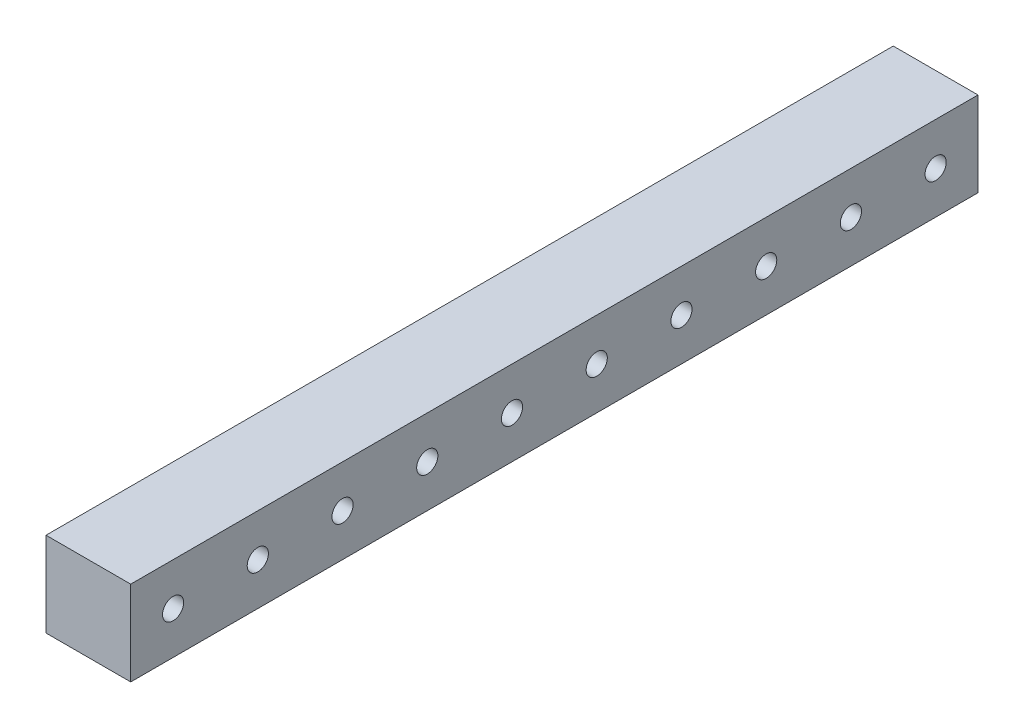
ISO-10303-21;
HEADER;
FILE_DESCRIPTION(('STEP AP214'),'2;1');
FILE_NAME('part.step','',(''),(''),'','','');
FILE_SCHEMA(('AUTOMOTIVE_DESIGN { 1 0 10303 214 1 1 1 1 }'));
ENDSEC;
DATA;
#1=APPLICATION_CONTEXT('core data for automotive mechanical design processes');
#2=APPLICATION_PROTOCOL_DEFINITION('international standard','automotive_design',2000,#1);
#3=PRODUCT_CONTEXT('',#1,'mechanical');
#4=PRODUCT('Part','Part','',(#3));
#5=PRODUCT_RELATED_PRODUCT_CATEGORY('part','',(#4));
#6=PRODUCT_DEFINITION_FORMATION('','',#4);
#7=PRODUCT_DEFINITION_CONTEXT('part definition',#1,'design');
#8=PRODUCT_DEFINITION('design','',#6,#7);
#9=PRODUCT_DEFINITION_SHAPE('','',#8);
#10=(LENGTH_UNIT() NAMED_UNIT(*) SI_UNIT(.MILLI.,.METRE.));
#11=(NAMED_UNIT(*) PLANE_ANGLE_UNIT() SI_UNIT($,.RADIAN.));
#12=(NAMED_UNIT(*) SI_UNIT($,.STERADIAN.) SOLID_ANGLE_UNIT());
#13=UNCERTAINTY_MEASURE_WITH_UNIT(LENGTH_MEASURE(1.E-05),#10,'distance_accuracy_value','');
#14=(GEOMETRIC_REPRESENTATION_CONTEXT(3) GLOBAL_UNCERTAINTY_ASSIGNED_CONTEXT((#13)) GLOBAL_UNIT_ASSIGNED_CONTEXT((#10,
#11,#12)) REPRESENTATION_CONTEXT('',''));
#15=CARTESIAN_POINT('',(0.,0.,0.));
#16=DIRECTION('',(0.,0.,1.));
#17=DIRECTION('',(1.,0.,0.));
#18=AXIS2_PLACEMENT_3D('',#15,#16,#17);
#19=CARTESIAN_POINT('',(10.,0.,190.));
#20=DIRECTION('',(1.,0.,0.));
#21=DIRECTION('',(0.,0.,-1.));
#22=AXIS2_PLACEMENT_3D('',#19,#20,#21);
#23=CYLINDRICAL_SURFACE('',#22,2.5);
#24=CARTESIAN_POINT('',(-10.,0.,190.));
#25=DIRECTION('',(1.,0.,0.));
#26=DIRECTION('',(0.,0.,-1.));
#27=AXIS2_PLACEMENT_3D('',#24,#25,#26);
#28=CIRCLE('',#27,2.5);
#29=CARTESIAN_POINT('',(-10.,0.,187.5));
#30=VERTEX_POINT('',#29);
#31=EDGE_CURVE('E40',#30,#30,#28,.T.);
#32=ORIENTED_EDGE('',*,*,#31,.F.);
#33=EDGE_LOOP('',(#32));
#34=FACE_BOUND('',#33,.T.);
#35=CARTESIAN_POINT('',(10.,0.,190.));
#36=DIRECTION('',(1.,0.,0.));
#37=DIRECTION('',(0.,0.,-1.));
#38=AXIS2_PLACEMENT_3D('',#35,#36,#37);
#39=CIRCLE('',#38,2.5);
#40=CARTESIAN_POINT('',(10.,0.,187.5));
#41=VERTEX_POINT('',#40);
#42=EDGE_CURVE('E11',#41,#41,#39,.T.);
#43=ORIENTED_EDGE('',*,*,#42,.T.);
#44=EDGE_LOOP('',(#43));
#45=FACE_BOUND('',#44,.T.);
#46=ADVANCED_FACE('F32',(#34,#45),#23,.F.);
#47=CARTESIAN_POINT('',(10.,0.,170.));
#48=DIRECTION('',(1.,0.,0.));
#49=DIRECTION('',(0.,0.,-1.));
#50=AXIS2_PLACEMENT_3D('',#47,#48,#49);
#51=CYLINDRICAL_SURFACE('',#50,2.5);
#52=CARTESIAN_POINT('',(-10.,0.,170.));
#53=DIRECTION('',(1.,0.,0.));
#54=DIRECTION('',(0.,0.,-1.));
#55=AXIS2_PLACEMENT_3D('',#52,#53,#54);
#56=CIRCLE('',#55,2.5);
#57=CARTESIAN_POINT('',(-10.,0.,167.5));
#58=VERTEX_POINT('',#57);
#59=EDGE_CURVE('E146',#58,#58,#56,.T.);
#60=ORIENTED_EDGE('',*,*,#59,.F.);
#61=EDGE_LOOP('',(#60));
#62=FACE_BOUND('',#61,.T.);
#63=CARTESIAN_POINT('',(10.,0.,170.));
#64=DIRECTION('',(1.,0.,0.));
#65=DIRECTION('',(0.,0.,-1.));
#66=AXIS2_PLACEMENT_3D('',#63,#64,#65);
#67=CIRCLE('',#66,2.5);
#68=CARTESIAN_POINT('',(10.,0.,167.5));
#69=VERTEX_POINT('',#68);
#70=EDGE_CURVE('E149',#69,#69,#67,.T.);
#71=ORIENTED_EDGE('',*,*,#70,.T.);
#72=EDGE_LOOP('',(#71));
#73=FACE_BOUND('',#72,.T.);
#74=ADVANCED_FACE('F158',(#62,#73),#51,.F.);
#75=CARTESIAN_POINT('',(10.,0.,150.));
#76=DIRECTION('',(1.,0.,0.));
#77=DIRECTION('',(0.,0.,-1.));
#78=AXIS2_PLACEMENT_3D('',#75,#76,#77);
#79=CYLINDRICAL_SURFACE('',#78,2.5);
#80=CARTESIAN_POINT('',(-10.,0.,150.));
#81=DIRECTION('',(1.,0.,0.));
#82=DIRECTION('',(0.,0.,-1.));
#83=AXIS2_PLACEMENT_3D('',#80,#81,#82);
#84=CIRCLE('',#83,2.5);
#85=CARTESIAN_POINT('',(-10.,0.,147.5));
#86=VERTEX_POINT('',#85);
#87=EDGE_CURVE('E140',#86,#86,#84,.T.);
#88=ORIENTED_EDGE('',*,*,#87,.F.);
#89=EDGE_LOOP('',(#88));
#90=FACE_BOUND('',#89,.T.);
#91=CARTESIAN_POINT('',(10.,0.,150.));
#92=DIRECTION('',(1.,0.,0.));
#93=DIRECTION('',(0.,0.,-1.));
#94=AXIS2_PLACEMENT_3D('',#91,#92,#93);
#95=CIRCLE('',#94,2.5);
#96=CARTESIAN_POINT('',(10.,0.,147.5));
#97=VERTEX_POINT('',#96);
#98=EDGE_CURVE('E143',#97,#97,#95,.T.);
#99=ORIENTED_EDGE('',*,*,#98,.T.);
#100=EDGE_LOOP('',(#99));
#101=FACE_BOUND('',#100,.T.);
#102=ADVANCED_FACE('F197',(#90,#101),#79,.F.);
#103=CARTESIAN_POINT('',(10.,0.,130.));
#104=DIRECTION('',(1.,0.,0.));
#105=DIRECTION('',(0.,0.,-1.));
#106=AXIS2_PLACEMENT_3D('',#103,#104,#105);
#107=CYLINDRICAL_SURFACE('',#106,2.5);
#108=CARTESIAN_POINT('',(-10.,0.,130.));
#109=DIRECTION('',(1.,0.,0.));
#110=DIRECTION('',(0.,0.,-1.));
#111=AXIS2_PLACEMENT_3D('',#108,#109,#110);
#112=CIRCLE('',#111,2.5);
#113=CARTESIAN_POINT('',(-10.,0.,127.5));
#114=VERTEX_POINT('',#113);
#115=EDGE_CURVE('E134',#114,#114,#112,.T.);
#116=ORIENTED_EDGE('',*,*,#115,.F.);
#117=EDGE_LOOP('',(#116));
#118=FACE_BOUND('',#117,.T.);
#119=CARTESIAN_POINT('',(10.,0.,130.));
#120=DIRECTION('',(1.,0.,0.));
#121=DIRECTION('',(0.,0.,-1.));
#122=AXIS2_PLACEMENT_3D('',#119,#120,#121);
#123=CIRCLE('',#122,2.5);
#124=CARTESIAN_POINT('',(10.,0.,127.5));
#125=VERTEX_POINT('',#124);
#126=EDGE_CURVE('E137',#125,#125,#123,.T.);
#127=ORIENTED_EDGE('',*,*,#126,.T.);
#128=EDGE_LOOP('',(#127));
#129=FACE_BOUND('',#128,.T.);
#130=ADVANCED_FACE('F193',(#118,#129),#107,.F.);
#131=CARTESIAN_POINT('',(10.,0.,110.));
#132=DIRECTION('',(1.,0.,0.));
#133=DIRECTION('',(0.,0.,-1.));
#134=AXIS2_PLACEMENT_3D('',#131,#132,#133);
#135=CYLINDRICAL_SURFACE('',#134,2.5);
#136=CARTESIAN_POINT('',(-10.,0.,110.));
#137=DIRECTION('',(1.,0.,0.));
#138=DIRECTION('',(0.,0.,-1.));
#139=AXIS2_PLACEMENT_3D('',#136,#137,#138);
#140=CIRCLE('',#139,2.5);
#141=CARTESIAN_POINT('',(-10.,0.,107.5));
#142=VERTEX_POINT('',#141);
#143=EDGE_CURVE('E128',#142,#142,#140,.T.);
#144=ORIENTED_EDGE('',*,*,#143,.F.);
#145=EDGE_LOOP('',(#144));
#146=FACE_BOUND('',#145,.T.);
#147=CARTESIAN_POINT('',(10.,0.,110.));
#148=DIRECTION('',(1.,0.,0.));
#149=DIRECTION('',(0.,0.,-1.));
#150=AXIS2_PLACEMENT_3D('',#147,#148,#149);
#151=CIRCLE('',#150,2.5);
#152=CARTESIAN_POINT('',(10.,0.,107.5));
#153=VERTEX_POINT('',#152);
#154=EDGE_CURVE('E131',#153,#153,#151,.T.);
#155=ORIENTED_EDGE('',*,*,#154,.T.);
#156=EDGE_LOOP('',(#155));
#157=FACE_BOUND('',#156,.T.);
#158=ADVANCED_FACE('F189',(#146,#157),#135,.F.);
#159=CARTESIAN_POINT('',(10.,0.,90.));
#160=DIRECTION('',(1.,0.,0.));
#161=DIRECTION('',(0.,0.,-1.));
#162=AXIS2_PLACEMENT_3D('',#159,#160,#161);
#163=CYLINDRICAL_SURFACE('',#162,2.5);
#164=CARTESIAN_POINT('',(-10.,0.,90.));
#165=DIRECTION('',(1.,0.,0.));
#166=DIRECTION('',(0.,0.,-1.));
#167=AXIS2_PLACEMENT_3D('',#164,#165,#166);
#168=CIRCLE('',#167,2.5);
#169=CARTESIAN_POINT('',(-10.,0.,87.5));
#170=VERTEX_POINT('',#169);
#171=EDGE_CURVE('E122',#170,#170,#168,.T.);
#172=ORIENTED_EDGE('',*,*,#171,.F.);
#173=EDGE_LOOP('',(#172));
#174=FACE_BOUND('',#173,.T.);
#175=CARTESIAN_POINT('',(10.,0.,90.));
#176=DIRECTION('',(1.,0.,0.));
#177=DIRECTION('',(0.,0.,-1.));
#178=AXIS2_PLACEMENT_3D('',#175,#176,#177);
#179=CIRCLE('',#178,2.5);
#180=CARTESIAN_POINT('',(10.,0.,87.5));
#181=VERTEX_POINT('',#180);
#182=EDGE_CURVE('E125',#181,#181,#179,.T.);
#183=ORIENTED_EDGE('',*,*,#182,.T.);
#184=EDGE_LOOP('',(#183));
#185=FACE_BOUND('',#184,.T.);
#186=ADVANCED_FACE('F185',(#174,#185),#163,.F.);
#187=CARTESIAN_POINT('',(10.,0.,70.));
#188=DIRECTION('',(1.,0.,0.));
#189=DIRECTION('',(0.,0.,-1.));
#190=AXIS2_PLACEMENT_3D('',#187,#188,#189);
#191=CYLINDRICAL_SURFACE('',#190,2.5);
#192=CARTESIAN_POINT('',(-10.,0.,70.));
#193=DIRECTION('',(1.,0.,0.));
#194=DIRECTION('',(0.,0.,-1.));
#195=AXIS2_PLACEMENT_3D('',#192,#193,#194);
#196=CIRCLE('',#195,2.5);
#197=CARTESIAN_POINT('',(-10.,0.,67.5));
#198=VERTEX_POINT('',#197);
#199=EDGE_CURVE('E116',#198,#198,#196,.T.);
#200=ORIENTED_EDGE('',*,*,#199,.F.);
#201=EDGE_LOOP('',(#200));
#202=FACE_BOUND('',#201,.T.);
#203=CARTESIAN_POINT('',(10.,0.,70.));
#204=DIRECTION('',(1.,0.,0.));
#205=DIRECTION('',(0.,0.,-1.));
#206=AXIS2_PLACEMENT_3D('',#203,#204,#205);
#207=CIRCLE('',#206,2.5);
#208=CARTESIAN_POINT('',(10.,0.,67.5));
#209=VERTEX_POINT('',#208);
#210=EDGE_CURVE('E119',#209,#209,#207,.T.);
#211=ORIENTED_EDGE('',*,*,#210,.T.);
#212=EDGE_LOOP('',(#211));
#213=FACE_BOUND('',#212,.T.);
#214=ADVANCED_FACE('F181',(#202,#213),#191,.F.);
#215=CARTESIAN_POINT('',(10.,0.,50.));
#216=DIRECTION('',(1.,0.,0.));
#217=DIRECTION('',(0.,0.,-1.));
#218=AXIS2_PLACEMENT_3D('',#215,#216,#217);
#219=CYLINDRICAL_SURFACE('',#218,2.5);
#220=CARTESIAN_POINT('',(-10.,0.,50.));
#221=DIRECTION('',(1.,0.,0.));
#222=DIRECTION('',(0.,0.,-1.));
#223=AXIS2_PLACEMENT_3D('',#220,#221,#222);
#224=CIRCLE('',#223,2.5);
#225=CARTESIAN_POINT('',(-10.,0.,47.5));
#226=VERTEX_POINT('',#225);
#227=EDGE_CURVE('E110',#226,#226,#224,.T.);
#228=ORIENTED_EDGE('',*,*,#227,.F.);
#229=EDGE_LOOP('',(#228));
#230=FACE_BOUND('',#229,.T.);
#231=CARTESIAN_POINT('',(10.,0.,50.));
#232=DIRECTION('',(1.,0.,0.));
#233=DIRECTION('',(0.,0.,-1.));
#234=AXIS2_PLACEMENT_3D('',#231,#232,#233);
#235=CIRCLE('',#234,2.5);
#236=CARTESIAN_POINT('',(10.,0.,47.5));
#237=VERTEX_POINT('',#236);
#238=EDGE_CURVE('E113',#237,#237,#235,.T.);
#239=ORIENTED_EDGE('',*,*,#238,.T.);
#240=EDGE_LOOP('',(#239));
#241=FACE_BOUND('',#240,.T.);
#242=ADVANCED_FACE('F177',(#230,#241),#219,.F.);
#243=CARTESIAN_POINT('',(-10.,10.0000000000001,200.));
#244=DIRECTION('',(1.,0.,0.));
#245=DIRECTION('',(0.,1.,0.));
#246=AXIS2_PLACEMENT_3D('',#243,#244,#245);
#247=PLANE('',#246);
#248=CARTESIAN_POINT('',(-10.,0.,30.));
#249=DIRECTION('',(1.,0.,0.));
#250=DIRECTION('',(0.,0.,-1.));
#251=AXIS2_PLACEMENT_3D('',#248,#249,#250);
#252=CIRCLE('',#251,2.5);
#253=CARTESIAN_POINT('',(-10.,0.,27.5));
#254=VERTEX_POINT('',#253);
#255=EDGE_CURVE('E316',#254,#254,#252,.T.);
#256=ORIENTED_EDGE('',*,*,#255,.T.);
#257=EDGE_LOOP('',(#256));
#258=FACE_BOUND('',#257,.T.);
#259=CARTESIAN_POINT('',(-10.,0.,10.));
#260=DIRECTION('',(1.,0.,0.));
#261=DIRECTION('',(0.,0.,-1.));
#262=AXIS2_PLACEMENT_3D('',#259,#260,#261);
#263=CIRCLE('',#262,2.5);
#264=CARTESIAN_POINT('',(-10.,0.,7.50000000000001));
#265=VERTEX_POINT('',#264);
#266=EDGE_CURVE('E103',#265,#265,#263,.T.);
#267=ORIENTED_EDGE('',*,*,#266,.T.);
#268=EDGE_LOOP('',(#267));
#269=FACE_BOUND('',#268,.T.);
#270=DIRECTION('',(0.,-1.,0.));
#271=VECTOR('',#270,1.);
#272=CARTESIAN_POINT('',(-10.,10.0000000000001,0.));
#273=LINE('',#272,#271);
#274=CARTESIAN_POINT('',(-10.,10.0000000000001,0.));
#275=VERTEX_POINT('',#274);
#276=CARTESIAN_POINT('',(-10.,-10.0000000000001,0.));
#277=VERTEX_POINT('',#276);
#278=EDGE_CURVE('E100',#275,#277,#273,.T.);
#279=ORIENTED_EDGE('',*,*,#278,.T.);
#280=DIRECTION('',(0.,0.,-1.));
#281=VECTOR('',#280,1.);
#282=CARTESIAN_POINT('',(-10.,-10.0000000000001,200.));
#283=LINE('',#282,#281);
#284=CARTESIAN_POINT('',(-10.,-10.0000000000001,200.));
#285=VERTEX_POINT('',#284);
#286=EDGE_CURVE('E90',#285,#277,#283,.T.);
#287=ORIENTED_EDGE('',*,*,#286,.F.);
#288=DIRECTION('',(0.,-1.,0.));
#289=VECTOR('',#288,1.);
#290=CARTESIAN_POINT('',(-10.,10.0000000000001,200.));
#291=LINE('',#290,#289);
#292=CARTESIAN_POINT('',(-10.,10.0000000000001,200.));
#293=VERTEX_POINT('',#292);
#294=EDGE_CURVE('E84',#293,#285,#291,.T.);
#295=ORIENTED_EDGE('',*,*,#294,.F.);
#296=DIRECTION('',(0.,0.,-1.));
#297=VECTOR('',#296,1.);
#298=CARTESIAN_POINT('',(-10.,10.0000000000001,200.));
#299=LINE('',#298,#297);
#300=EDGE_CURVE('E96',#293,#275,#299,.T.);
#301=ORIENTED_EDGE('',*,*,#300,.T.);
#302=EDGE_LOOP('',(#279,#287,#295,#301));
#303=FACE_BOUND('',#302,.T.);
#304=ORIENTED_EDGE('',*,*,#227,.T.);
#305=EDGE_LOOP('',(#304));
#306=FACE_BOUND('',#305,.T.);
#307=ORIENTED_EDGE('',*,*,#199,.T.);
#308=EDGE_LOOP('',(#307));
#309=FACE_BOUND('',#308,.T.);
#310=ORIENTED_EDGE('',*,*,#171,.T.);
#311=EDGE_LOOP('',(#310));
#312=FACE_BOUND('',#311,.T.);
#313=ORIENTED_EDGE('',*,*,#143,.T.);
#314=EDGE_LOOP('',(#313));
#315=FACE_BOUND('',#314,.T.);
#316=ORIENTED_EDGE('',*,*,#115,.T.);
#317=EDGE_LOOP('',(#316));
#318=FACE_BOUND('',#317,.T.);
#319=ORIENTED_EDGE('',*,*,#87,.T.);
#320=EDGE_LOOP('',(#319));
#321=FACE_BOUND('',#320,.T.);
#322=ORIENTED_EDGE('',*,*,#59,.T.);
#323=EDGE_LOOP('',(#322));
#324=FACE_BOUND('',#323,.T.);
#325=ORIENTED_EDGE('',*,*,#31,.T.);
#326=EDGE_LOOP('',(#325));
#327=FACE_BOUND('',#326,.T.);
#328=ADVANCED_FACE('F154',(#258,#269,#303,#306,#309,#312,#315,#318,#321,#324,#327),#247,.F.);
#329=CARTESIAN_POINT('',(-10.,-10.0000000000001,200.));
#330=DIRECTION('',(0.,1.,0.));
#331=DIRECTION('',(0.,0.,1.));
#332=AXIS2_PLACEMENT_3D('',#329,#330,#331);
#333=PLANE('',#332);
#334=DIRECTION('',(1.,0.,0.));
#335=VECTOR('',#334,1.);
#336=CARTESIAN_POINT('',(-10.,-10.0000000000001,0.));
#337=LINE('',#336,#335);
#338=CARTESIAN_POINT('',(10.,-10.0000000000001,0.));
#339=VERTEX_POINT('',#338);
#340=EDGE_CURVE('E89',#277,#339,#337,.T.);
#341=ORIENTED_EDGE('',*,*,#340,.T.);
#342=DIRECTION('',(0.,0.,-1.));
#343=VECTOR('',#342,1.);
#344=CARTESIAN_POINT('',(10.,-10.0000000000001,200.));
#345=LINE('',#344,#343);
#346=CARTESIAN_POINT('',(10.,-10.0000000000001,200.));
#347=VERTEX_POINT('',#346);
#348=EDGE_CURVE('E87',#347,#339,#345,.T.);
#349=ORIENTED_EDGE('',*,*,#348,.F.);
#350=DIRECTION('',(1.,0.,0.));
#351=VECTOR('',#350,1.);
#352=CARTESIAN_POINT('',(-10.,-10.0000000000001,200.));
#353=LINE('',#352,#351);
#354=EDGE_CURVE('E79',#285,#347,#353,.T.);
#355=ORIENTED_EDGE('',*,*,#354,.F.);
#356=ORIENTED_EDGE('',*,*,#286,.T.);
#357=EDGE_LOOP('',(#341,#349,#355,#356));
#358=FACE_BOUND('',#357,.T.);
#359=ADVANCED_FACE('F88',(#358),#333,.F.);
#360=CARTESIAN_POINT('',(10.,10.0000000000001,200.));
#361=DIRECTION('',(-1.,0.,0.));
#362=DIRECTION('',(0.,-1.,0.));
#363=AXIS2_PLACEMENT_3D('',#360,#361,#362);
#364=PLANE('',#363);
#365=CARTESIAN_POINT('',(10.,0.,30.));
#366=DIRECTION('',(1.,0.,0.));
#367=DIRECTION('',(0.,0.,-1.));
#368=AXIS2_PLACEMENT_3D('',#365,#366,#367);
#369=CIRCLE('',#368,2.5);
#370=CARTESIAN_POINT('',(10.,0.,27.5));
#371=VERTEX_POINT('',#370);
#372=EDGE_CURVE('E318',#371,#371,#369,.T.);
#373=ORIENTED_EDGE('',*,*,#372,.F.);
#374=EDGE_LOOP('',(#373));
#375=FACE_BOUND('',#374,.T.);
#376=CARTESIAN_POINT('',(10.,0.,10.));
#377=DIRECTION('',(1.,0.,0.));
#378=DIRECTION('',(0.,0.,-1.));
#379=AXIS2_PLACEMENT_3D('',#376,#377,#378);
#380=CIRCLE('',#379,2.5);
#381=CARTESIAN_POINT('',(10.,0.,7.5));
#382=VERTEX_POINT('',#381);
#383=EDGE_CURVE('E319',#382,#382,#380,.T.);
#384=ORIENTED_EDGE('',*,*,#383,.F.);
#385=EDGE_LOOP('',(#384));
#386=FACE_BOUND('',#385,.T.);
#387=DIRECTION('',(0.,1.,0.));
#388=VECTOR('',#387,1.);
#389=CARTESIAN_POINT('',(10.,10.0000000000001,0.));
#390=LINE('',#389,#388);
#391=CARTESIAN_POINT('',(10.,10.0000000000001,0.));
#392=VERTEX_POINT('',#391);
#393=EDGE_CURVE('E65',#339,#392,#390,.T.);
#394=ORIENTED_EDGE('',*,*,#393,.T.);
#395=DIRECTION('',(0.,0.,-1.));
#396=VECTOR('',#395,1.);
#397=CARTESIAN_POINT('',(10.,10.0000000000001,200.));
#398=LINE('',#397,#396);
#399=CARTESIAN_POINT('',(10.,10.0000000000001,200.));
#400=VERTEX_POINT('',#399);
#401=EDGE_CURVE('E91',#400,#392,#398,.T.);
#402=ORIENTED_EDGE('',*,*,#401,.F.);
#403=DIRECTION('',(0.,1.,0.));
#404=VECTOR('',#403,1.);
#405=CARTESIAN_POINT('',(10.,10.0000000000001,200.));
#406=LINE('',#405,#404);
#407=EDGE_CURVE('E82',#347,#400,#406,.T.);
#408=ORIENTED_EDGE('',*,*,#407,.F.);
#409=ORIENTED_EDGE('',*,*,#348,.T.);
#410=EDGE_LOOP('',(#394,#402,#408,#409));
#411=FACE_BOUND('',#410,.T.);
#412=ORIENTED_EDGE('',*,*,#238,.F.);
#413=EDGE_LOOP('',(#412));
#414=FACE_BOUND('',#413,.T.);
#415=ORIENTED_EDGE('',*,*,#210,.F.);
#416=EDGE_LOOP('',(#415));
#417=FACE_BOUND('',#416,.T.);
#418=ORIENTED_EDGE('',*,*,#182,.F.);
#419=EDGE_LOOP('',(#418));
#420=FACE_BOUND('',#419,.T.);
#421=ORIENTED_EDGE('',*,*,#154,.F.);
#422=EDGE_LOOP('',(#421));
#423=FACE_BOUND('',#422,.T.);
#424=ORIENTED_EDGE('',*,*,#126,.F.);
#425=EDGE_LOOP('',(#424));
#426=FACE_BOUND('',#425,.T.);
#427=ORIENTED_EDGE('',*,*,#98,.F.);
#428=EDGE_LOOP('',(#427));
#429=FACE_BOUND('',#428,.T.);
#430=ORIENTED_EDGE('',*,*,#70,.F.);
#431=EDGE_LOOP('',(#430));
#432=FACE_BOUND('',#431,.T.);
#433=ORIENTED_EDGE('',*,*,#42,.F.);
#434=EDGE_LOOP('',(#433));
#435=FACE_BOUND('',#434,.T.);
#436=ADVANCED_FACE('F93',(#375,#386,#411,#414,#417,#420,#423,#426,#429,#432,#435),#364,.F.);
#437=CARTESIAN_POINT('',(-10.,10.0000000000001,200.));
#438=DIRECTION('',(0.,-1.,0.));
#439=DIRECTION('',(0.,0.,-1.));
#440=AXIS2_PLACEMENT_3D('',#437,#438,#439);
#441=PLANE('',#440);
#442=DIRECTION('',(-1.,0.,0.));
#443=VECTOR('',#442,1.);
#444=CARTESIAN_POINT('',(-10.,10.0000000000001,0.));
#445=LINE('',#444,#443);
#446=EDGE_CURVE('E71',#392,#275,#445,.T.);
#447=ORIENTED_EDGE('',*,*,#446,.T.);
#448=ORIENTED_EDGE('',*,*,#300,.F.);
#449=DIRECTION('',(-1.,0.,0.));
#450=VECTOR('',#449,1.);
#451=CARTESIAN_POINT('',(-10.,10.0000000000001,200.));
#452=LINE('',#451,#450);
#453=EDGE_CURVE('E48',#400,#293,#452,.T.);
#454=ORIENTED_EDGE('',*,*,#453,.F.);
#455=ORIENTED_EDGE('',*,*,#401,.T.);
#456=EDGE_LOOP('',(#447,#448,#454,#455));
#457=FACE_BOUND('',#456,.T.);
#458=ADVANCED_FACE('F162',(#457),#441,.F.);
#459=CARTESIAN_POINT('',(0.,0.,200.));
#460=DIRECTION('',(0.,0.,1.));
#461=DIRECTION('',(1.,0.,0.));
#462=AXIS2_PLACEMENT_3D('',#459,#460,#461);
#463=PLANE('',#462);
#464=ORIENTED_EDGE('',*,*,#294,.T.);
#465=ORIENTED_EDGE('',*,*,#354,.T.);
#466=ORIENTED_EDGE('',*,*,#407,.T.);
#467=ORIENTED_EDGE('',*,*,#453,.T.);
#468=EDGE_LOOP('',(#464,#465,#466,#467));
#469=FACE_BOUND('',#468,.T.);
#470=ADVANCED_FACE('F80',(#469),#463,.T.);
#471=CARTESIAN_POINT('',(0.,0.,0.));
#472=DIRECTION('',(0.,0.,1.));
#473=DIRECTION('',(1.,0.,0.));
#474=AXIS2_PLACEMENT_3D('',#471,#472,#473);
#475=PLANE('',#474);
#476=ORIENTED_EDGE('',*,*,#278,.F.);
#477=ORIENTED_EDGE('',*,*,#446,.F.);
#478=ORIENTED_EDGE('',*,*,#393,.F.);
#479=ORIENTED_EDGE('',*,*,#340,.F.);
#480=EDGE_LOOP('',(#476,#477,#478,#479));
#481=FACE_BOUND('',#480,.T.);
#482=ADVANCED_FACE('F260',(#481),#475,.F.);
#483=CARTESIAN_POINT('',(10.,0.,10.));
#484=DIRECTION('',(1.,0.,0.));
#485=DIRECTION('',(0.,0.,-1.));
#486=AXIS2_PLACEMENT_3D('',#483,#484,#485);
#487=CYLINDRICAL_SURFACE('',#486,2.5);
#488=ORIENTED_EDGE('',*,*,#266,.F.);
#489=EDGE_LOOP('',(#488));
#490=FACE_BOUND('',#489,.T.);
#491=ORIENTED_EDGE('',*,*,#383,.T.);
#492=EDGE_LOOP('',(#491));
#493=FACE_BOUND('',#492,.T.);
#494=ADVANCED_FACE('F269',(#490,#493),#487,.F.);
#495=CARTESIAN_POINT('',(10.,0.,30.));
#496=DIRECTION('',(1.,0.,0.));
#497=DIRECTION('',(0.,0.,-1.));
#498=AXIS2_PLACEMENT_3D('',#495,#496,#497);
#499=CYLINDRICAL_SURFACE('',#498,2.5);
#500=ORIENTED_EDGE('',*,*,#255,.F.);
#501=EDGE_LOOP('',(#500));
#502=FACE_BOUND('',#501,.T.);
#503=ORIENTED_EDGE('',*,*,#372,.T.);
#504=EDGE_LOOP('',(#503));
#505=FACE_BOUND('',#504,.T.);
#506=ADVANCED_FACE('F277',(#502,#505),#499,.F.);
#507=CLOSED_SHELL('',(#46,#74,#102,#130,#158,#186,#214,#242,#328,#359,#436,#458,#470,#482,#494,#506));
#508=MANIFOLD_SOLID_BREP('B2',#507);
#509=ADVANCED_BREP_SHAPE_REPRESENTATION('',(#18,#508),#14);
#510=SHAPE_DEFINITION_REPRESENTATION(#9,#509);
ENDSEC;
END-ISO-10303-21;
